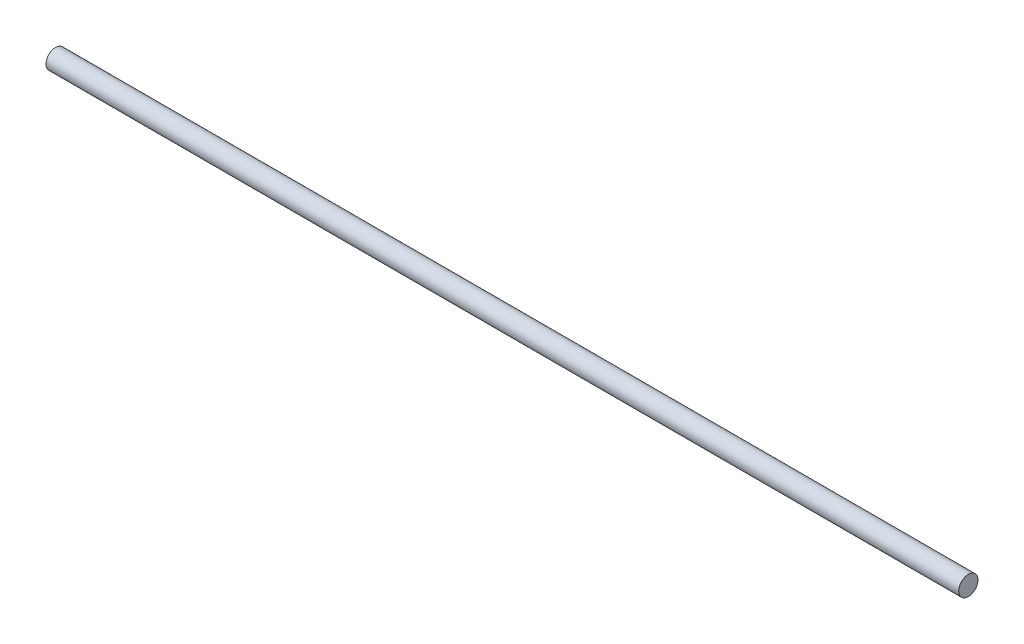
ISO-10303-21;
HEADER;
FILE_DESCRIPTION(('STEP AP214'),'2;1');
FILE_NAME('part.step','',(''),(''),'','','');
FILE_SCHEMA(('AUTOMOTIVE_DESIGN { 1 0 10303 214 1 1 1 1 }'));
ENDSEC;
DATA;
#1=APPLICATION_CONTEXT('core data for automotive mechanical design processes');
#2=APPLICATION_PROTOCOL_DEFINITION('international standard','automotive_design',2000,#1);
#3=PRODUCT_CONTEXT('',#1,'mechanical');
#4=PRODUCT('Part','Part','',(#3));
#5=PRODUCT_RELATED_PRODUCT_CATEGORY('part','',(#4));
#6=PRODUCT_DEFINITION_FORMATION('','',#4);
#7=PRODUCT_DEFINITION_CONTEXT('part definition',#1,'design');
#8=PRODUCT_DEFINITION('design','',#6,#7);
#9=PRODUCT_DEFINITION_SHAPE('','',#8);
#10=(LENGTH_UNIT() NAMED_UNIT(*) SI_UNIT(.MILLI.,.METRE.));
#11=(NAMED_UNIT(*) PLANE_ANGLE_UNIT() SI_UNIT($,.RADIAN.));
#12=(NAMED_UNIT(*) SI_UNIT($,.STERADIAN.) SOLID_ANGLE_UNIT());
#13=UNCERTAINTY_MEASURE_WITH_UNIT(LENGTH_MEASURE(1.E-05),#10,'distance_accuracy_value','');
#14=(GEOMETRIC_REPRESENTATION_CONTEXT(3) GLOBAL_UNCERTAINTY_ASSIGNED_CONTEXT((#13)) GLOBAL_UNIT_ASSIGNED_CONTEXT((#10,
#11,#12)) REPRESENTATION_CONTEXT('',''));
#15=CARTESIAN_POINT('',(0.,0.,0.));
#16=DIRECTION('',(0.,0.,1.));
#17=DIRECTION('',(1.,0.,0.));
#18=AXIS2_PLACEMENT_3D('',#15,#16,#17);
#19=CARTESIAN_POINT('',(300.,0.,0.));
#20=DIRECTION('',(-1.,0.,0.));
#21=DIRECTION('',(0.,0.,1.));
#22=AXIS2_PLACEMENT_3D('',#19,#20,#21);
#23=CYLINDRICAL_SURFACE('',#22,6.35);
#24=CARTESIAN_POINT('',(300.,0.,0.));
#25=DIRECTION('',(1.,0.,0.));
#26=DIRECTION('',(0.,0.,-1.));
#27=AXIS2_PLACEMENT_3D('',#24,#25,#26);
#28=CIRCLE('',#27,6.35);
#29=CARTESIAN_POINT('',(300.,0.,-6.35));
#30=VERTEX_POINT('',#29);
#31=EDGE_CURVE('E10',#30,#30,#28,.T.);
#32=ORIENTED_EDGE('',*,*,#31,.F.);
#33=EDGE_LOOP('',(#32));
#34=FACE_BOUND('',#33,.T.);
#35=CARTESIAN_POINT('',(-300.,0.,0.));
#36=DIRECTION('',(1.,0.,0.));
#37=DIRECTION('',(0.,0.,-1.));
#38=AXIS2_PLACEMENT_3D('',#35,#36,#37);
#39=CIRCLE('',#38,6.35);
#40=CARTESIAN_POINT('',(-300.,0.,-6.35));
#41=VERTEX_POINT('',#40);
#42=EDGE_CURVE('E34',#41,#41,#39,.T.);
#43=ORIENTED_EDGE('',*,*,#42,.T.);
#44=EDGE_LOOP('',(#43));
#45=FACE_BOUND('',#44,.T.);
#46=ADVANCED_FACE('F31',(#34,#45),#23,.T.);
#47=CARTESIAN_POINT('',(300.,0.,0.));
#48=DIRECTION('',(1.,0.,0.));
#49=DIRECTION('',(0.,0.,-1.));
#50=AXIS2_PLACEMENT_3D('',#47,#48,#49);
#51=PLANE('',#50);
#52=ORIENTED_EDGE('',*,*,#31,.T.);
#53=EDGE_LOOP('',(#52));
#54=FACE_BOUND('',#53,.T.);
#55=ADVANCED_FACE('F46',(#54),#51,.T.);
#56=CARTESIAN_POINT('',(-300.,0.,0.));
#57=DIRECTION('',(1.,0.,0.));
#58=DIRECTION('',(0.,0.,-1.));
#59=AXIS2_PLACEMENT_3D('',#56,#57,#58);
#60=PLANE('',#59);
#61=ORIENTED_EDGE('',*,*,#42,.F.);
#62=EDGE_LOOP('',(#61));
#63=FACE_BOUND('',#62,.T.);
#64=ADVANCED_FACE('F44',(#63),#60,.F.);
#65=CLOSED_SHELL('',(#46,#55,#64));
#66=MANIFOLD_SOLID_BREP('B2',#65);
#67=ADVANCED_BREP_SHAPE_REPRESENTATION('',(#18,#66),#14);
#68=SHAPE_DEFINITION_REPRESENTATION(#9,#67);
ENDSEC;
END-ISO-10303-21;
